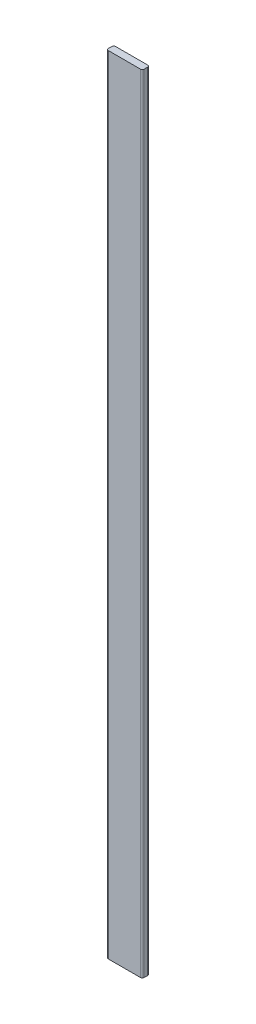
ISO-10303-21;
HEADER;
FILE_DESCRIPTION(('STEP AP214'),'2;1');
FILE_NAME('part.step','',(''),(''),'','','');
FILE_SCHEMA(('AUTOMOTIVE_DESIGN { 1 0 10303 214 1 1 1 1 }'));
ENDSEC;
DATA;
#1=APPLICATION_CONTEXT('core data for automotive mechanical design processes');
#2=APPLICATION_PROTOCOL_DEFINITION('international standard','automotive_design',2000,#1);
#3=PRODUCT_CONTEXT('',#1,'mechanical');
#4=PRODUCT('Part','Part','',(#3));
#5=PRODUCT_RELATED_PRODUCT_CATEGORY('part','',(#4));
#6=PRODUCT_DEFINITION_FORMATION('','',#4);
#7=PRODUCT_DEFINITION_CONTEXT('part definition',#1,'design');
#8=PRODUCT_DEFINITION('design','',#6,#7);
#9=PRODUCT_DEFINITION_SHAPE('','',#8);
#10=(LENGTH_UNIT() NAMED_UNIT(*) SI_UNIT(.MILLI.,.METRE.));
#11=(NAMED_UNIT(*) PLANE_ANGLE_UNIT() SI_UNIT($,.RADIAN.));
#12=(NAMED_UNIT(*) SI_UNIT($,.STERADIAN.) SOLID_ANGLE_UNIT());
#13=UNCERTAINTY_MEASURE_WITH_UNIT(LENGTH_MEASURE(1.E-05),#10,'distance_accuracy_value','');
#14=(GEOMETRIC_REPRESENTATION_CONTEXT(3) GLOBAL_UNCERTAINTY_ASSIGNED_CONTEXT((#13)) GLOBAL_UNIT_ASSIGNED_CONTEXT((#10,
#11,#12)) REPRESENTATION_CONTEXT('',''));
#15=CARTESIAN_POINT('',(0.,0.,0.));
#16=DIRECTION('',(0.,0.,1.));
#17=DIRECTION('',(1.,0.,0.));
#18=AXIS2_PLACEMENT_3D('',#15,#16,#17);
#19=CARTESIAN_POINT('',(-381.578947368421,2127.63157894737,20.));
#20=DIRECTION('',(1.,0.,0.));
#21=DIRECTION('',(0.,1.,0.));
#22=AXIS2_PLACEMENT_3D('',#19,#20,#21);
#23=PLANE('',#22);
#24=DIRECTION('',(0.,0.,-1.));
#25=VECTOR('',#24,1.);
#26=CARTESIAN_POINT('',(-381.578947368421,2127.63157894737,20.));
#27=LINE('',#26,#25);
#28=CARTESIAN_POINT('',(-381.578947368421,2127.63157894737,15.));
#29=VERTEX_POINT('',#28);
#30=CARTESIAN_POINT('',(-381.578947368421,2127.63157894737,5.));
#31=VERTEX_POINT('',#30);
#32=EDGE_CURVE('E161',#29,#31,#27,.T.);
#33=ORIENTED_EDGE('',*,*,#32,.T.);
#34=DIRECTION('',(0.,-1.,0.));
#35=VECTOR('',#34,1.);
#36=CARTESIAN_POINT('',(-381.578947368421,2127.63157894737,5.));
#37=LINE('',#36,#35);
#38=CARTESIAN_POINT('',(-381.57894736842,-72.3684210526315,5.));
#39=VERTEX_POINT('',#38);
#40=EDGE_CURVE('E117',#31,#39,#37,.T.);
#41=ORIENTED_EDGE('',*,*,#40,.T.);
#42=DIRECTION('',(0.,0.,-1.));
#43=VECTOR('',#42,1.);
#44=CARTESIAN_POINT('',(-381.57894736842,-72.3684210526315,20.));
#45=LINE('',#44,#43);
#46=CARTESIAN_POINT('',(-381.57894736842,-72.3684210526315,15.));
#47=VERTEX_POINT('',#46);
#48=EDGE_CURVE('E101',#47,#39,#45,.T.);
#49=ORIENTED_EDGE('',*,*,#48,.F.);
#50=DIRECTION('',(0.,-1.,0.));
#51=VECTOR('',#50,1.);
#52=CARTESIAN_POINT('',(-381.578947368421,2127.63157894737,15.));
#53=LINE('',#52,#51);
#54=EDGE_CURVE('E114',#47,#29,#53,.F.);
#55=ORIENTED_EDGE('',*,*,#54,.T.);
#56=EDGE_LOOP('',(#33,#41,#49,#55));
#57=FACE_BOUND('',#56,.T.);
#58=ADVANCED_FACE('F32',(#57),#23,.F.);
#59=CARTESIAN_POINT('',(-381.57894736842,-72.3684210526315,20.));
#60=DIRECTION('',(0.,1.,0.));
#61=DIRECTION('',(0.,0.,1.));
#62=AXIS2_PLACEMENT_3D('',#59,#60,#61);
#63=PLANE('',#62);
#64=ORIENTED_EDGE('',*,*,#48,.T.);
#65=CARTESIAN_POINT('',(-376.57894736842,-72.3684210526314,5.));
#66=DIRECTION('',(0.,1.,0.));
#67=DIRECTION('',(0.,0.,1.));
#68=AXIS2_PLACEMENT_3D('',#65,#66,#67);
#69=CIRCLE('',#68,5.);
#70=CARTESIAN_POINT('',(-376.57894736842,-72.3684210526315,0.));
#71=VERTEX_POINT('',#70);
#72=EDGE_CURVE('E108',#39,#71,#69,.F.);
#73=ORIENTED_EDGE('',*,*,#72,.T.);
#74=DIRECTION('',(1.,0.,0.));
#75=VECTOR('',#74,1.);
#76=CARTESIAN_POINT('',(-381.57894736842,-72.3684210526315,0.));
#77=LINE('',#76,#75);
#78=CARTESIAN_POINT('',(-286.57894736842,-72.3684210526315,0.));
#79=VERTEX_POINT('',#78);
#80=EDGE_CURVE('E167',#71,#79,#77,.T.);
#81=ORIENTED_EDGE('',*,*,#80,.T.);
#82=CARTESIAN_POINT('',(-286.57894736842,-72.3684210526314,5.));
#83=DIRECTION('',(0.,1.,0.));
#84=DIRECTION('',(0.,0.,1.));
#85=AXIS2_PLACEMENT_3D('',#82,#83,#84);
#86=CIRCLE('',#85,5.);
#87=CARTESIAN_POINT('',(-281.57894736842,-72.3684210526315,5.));
#88=VERTEX_POINT('',#87);
#89=EDGE_CURVE('E109',#79,#88,#86,.F.);
#90=ORIENTED_EDGE('',*,*,#89,.T.);
#91=DIRECTION('',(0.,0.,-1.));
#92=VECTOR('',#91,1.);
#93=CARTESIAN_POINT('',(-281.57894736842,-72.3684210526315,20.));
#94=LINE('',#93,#92);
#95=CARTESIAN_POINT('',(-281.57894736842,-72.3684210526315,15.));
#96=VERTEX_POINT('',#95);
#97=EDGE_CURVE('E118',#96,#88,#94,.T.);
#98=ORIENTED_EDGE('',*,*,#97,.F.);
#99=CARTESIAN_POINT('',(-286.57894736842,-72.3684210526315,15.));
#100=DIRECTION('',(0.,1.,0.));
#101=DIRECTION('',(0.,0.,1.));
#102=AXIS2_PLACEMENT_3D('',#99,#100,#101);
#103=CIRCLE('',#102,5.);
#104=CARTESIAN_POINT('',(-286.57894736842,-72.3684210526315,20.));
#105=VERTEX_POINT('',#104);
#106=EDGE_CURVE('E124',#96,#105,#103,.F.);
#107=ORIENTED_EDGE('',*,*,#106,.T.);
#108=DIRECTION('',(1.,0.,0.));
#109=VECTOR('',#108,1.);
#110=CARTESIAN_POINT('',(-381.57894736842,-72.3684210526315,20.));
#111=LINE('',#110,#109);
#112=CARTESIAN_POINT('',(-376.57894736842,-72.3684210526315,20.));
#113=VERTEX_POINT('',#112);
#114=EDGE_CURVE('E103',#113,#105,#111,.T.);
#115=ORIENTED_EDGE('',*,*,#114,.F.);
#116=CARTESIAN_POINT('',(-376.57894736842,-72.3684210526315,15.));
#117=DIRECTION('',(0.,1.,0.));
#118=DIRECTION('',(0.,0.,1.));
#119=AXIS2_PLACEMENT_3D('',#116,#117,#118);
#120=CIRCLE('',#119,5.);
#121=EDGE_CURVE('E98',#113,#47,#120,.F.);
#122=ORIENTED_EDGE('',*,*,#121,.T.);
#123=EDGE_LOOP('',(#64,#73,#81,#90,#98,#107,#115,#122));
#124=FACE_BOUND('',#123,.T.);
#125=ADVANCED_FACE('F100',(#124),#63,.F.);
#126=CARTESIAN_POINT('',(-281.578947368421,2127.63157894737,20.));
#127=DIRECTION('',(-1.,0.,0.));
#128=DIRECTION('',(0.,-1.,0.));
#129=AXIS2_PLACEMENT_3D('',#126,#127,#128);
#130=PLANE('',#129);
#131=ORIENTED_EDGE('',*,*,#97,.T.);
#132=DIRECTION('',(0.,1.,0.));
#133=VECTOR('',#132,1.);
#134=CARTESIAN_POINT('',(-281.578947368421,2127.63157894737,5.));
#135=LINE('',#134,#133);
#136=CARTESIAN_POINT('',(-281.578947368421,2127.63157894737,5.));
#137=VERTEX_POINT('',#136);
#138=EDGE_CURVE('E11',#88,#137,#135,.T.);
#139=ORIENTED_EDGE('',*,*,#138,.T.);
#140=DIRECTION('',(0.,0.,-1.));
#141=VECTOR('',#140,1.);
#142=CARTESIAN_POINT('',(-281.578947368421,2127.63157894737,20.));
#143=LINE('',#142,#141);
#144=CARTESIAN_POINT('',(-281.578947368421,2127.63157894737,15.));
#145=VERTEX_POINT('',#144);
#146=EDGE_CURVE('E149',#145,#137,#143,.T.);
#147=ORIENTED_EDGE('',*,*,#146,.F.);
#148=DIRECTION('',(0.,1.,0.));
#149=VECTOR('',#148,1.);
#150=CARTESIAN_POINT('',(-281.57894736842,-72.3684210526315,15.));
#151=LINE('',#150,#149);
#152=EDGE_CURVE('E40',#145,#96,#151,.F.);
#153=ORIENTED_EDGE('',*,*,#152,.T.);
#154=EDGE_LOOP('',(#131,#139,#147,#153));
#155=FACE_BOUND('',#154,.T.);
#156=ADVANCED_FACE('F148',(#155),#130,.F.);
#157=CARTESIAN_POINT('',(-381.578947368421,2127.63157894737,20.));
#158=DIRECTION('',(0.,-1.,0.));
#159=DIRECTION('',(0.,0.,-1.));
#160=AXIS2_PLACEMENT_3D('',#157,#158,#159);
#161=PLANE('',#160);
#162=DIRECTION('',(-1.,0.,0.));
#163=VECTOR('',#162,1.);
#164=CARTESIAN_POINT('',(-381.578947368421,2127.63157894737,0.));
#165=LINE('',#164,#163);
#166=CARTESIAN_POINT('',(-286.578947368421,2127.63157894737,0.));
#167=VERTEX_POINT('',#166);
#168=CARTESIAN_POINT('',(-376.578947368421,2127.63157894737,0.));
#169=VERTEX_POINT('',#168);
#170=EDGE_CURVE('E164',#167,#169,#165,.T.);
#171=ORIENTED_EDGE('',*,*,#170,.T.);
#172=CARTESIAN_POINT('',(-376.578947368421,2127.63157894737,5.));
#173=DIRECTION('',(0.,-1.,0.));
#174=DIRECTION('',(0.,0.,-1.));
#175=AXIS2_PLACEMENT_3D('',#172,#173,#174);
#176=CIRCLE('',#175,5.);
#177=EDGE_CURVE('E138',#169,#31,#176,.F.);
#178=ORIENTED_EDGE('',*,*,#177,.T.);
#179=ORIENTED_EDGE('',*,*,#32,.F.);
#180=CARTESIAN_POINT('',(-376.578947368421,2127.63157894737,15.));
#181=DIRECTION('',(0.,-1.,0.));
#182=DIRECTION('',(0.,0.,-1.));
#183=AXIS2_PLACEMENT_3D('',#180,#181,#182);
#184=CIRCLE('',#183,5.);
#185=CARTESIAN_POINT('',(-376.578947368421,2127.63157894737,20.));
#186=VERTEX_POINT('',#185);
#187=EDGE_CURVE('E122',#29,#186,#184,.F.);
#188=ORIENTED_EDGE('',*,*,#187,.T.);
#189=DIRECTION('',(-1.,0.,0.));
#190=VECTOR('',#189,1.);
#191=CARTESIAN_POINT('',(-381.578947368421,2127.63157894737,20.));
#192=LINE('',#191,#190);
#193=CARTESIAN_POINT('',(-286.578947368421,2127.63157894737,20.));
#194=VERTEX_POINT('',#193);
#195=EDGE_CURVE('E158',#194,#186,#192,.T.);
#196=ORIENTED_EDGE('',*,*,#195,.F.);
#197=CARTESIAN_POINT('',(-286.578947368421,2127.63157894737,15.));
#198=DIRECTION('',(0.,-1.,0.));
#199=DIRECTION('',(0.,0.,-1.));
#200=AXIS2_PLACEMENT_3D('',#197,#198,#199);
#201=CIRCLE('',#200,5.);
#202=EDGE_CURVE('E54',#194,#145,#201,.F.);
#203=ORIENTED_EDGE('',*,*,#202,.T.);
#204=ORIENTED_EDGE('',*,*,#146,.T.);
#205=CARTESIAN_POINT('',(-286.578947368421,2127.63157894737,5.));
#206=DIRECTION('',(0.,-1.,0.));
#207=DIRECTION('',(0.,0.,-1.));
#208=AXIS2_PLACEMENT_3D('',#205,#206,#207);
#209=CIRCLE('',#208,5.);
#210=EDGE_CURVE('E47',#137,#167,#209,.F.);
#211=ORIENTED_EDGE('',*,*,#210,.T.);
#212=EDGE_LOOP('',(#171,#178,#179,#188,#196,#203,#204,#211));
#213=FACE_BOUND('',#212,.T.);
#214=ADVANCED_FACE('F160',(#213),#161,.F.);
#215=CARTESIAN_POINT('',(0.,0.,20.));
#216=DIRECTION('',(0.,0.,1.));
#217=DIRECTION('',(1.,0.,0.));
#218=AXIS2_PLACEMENT_3D('',#215,#216,#217);
#219=PLANE('',#218);
#220=ORIENTED_EDGE('',*,*,#195,.T.);
#221=DIRECTION('',(0.,-1.,0.));
#222=VECTOR('',#221,1.);
#223=CARTESIAN_POINT('',(-376.57894736842,-72.3684210526315,20.));
#224=LINE('',#223,#222);
#225=EDGE_CURVE('E143',#186,#113,#224,.T.);
#226=ORIENTED_EDGE('',*,*,#225,.T.);
#227=ORIENTED_EDGE('',*,*,#114,.T.);
#228=DIRECTION('',(0.,1.,0.));
#229=VECTOR('',#228,1.);
#230=CARTESIAN_POINT('',(-286.578947368421,2127.63157894737,20.));
#231=LINE('',#230,#229);
#232=EDGE_CURVE('E140',#105,#194,#231,.T.);
#233=ORIENTED_EDGE('',*,*,#232,.T.);
#234=EDGE_LOOP('',(#220,#226,#227,#233));
#235=FACE_BOUND('',#234,.T.);
#236=ADVANCED_FACE('F157',(#235),#219,.T.);
#237=CARTESIAN_POINT('',(0.,0.,0.));
#238=DIRECTION('',(0.,0.,1.));
#239=DIRECTION('',(1.,0.,0.));
#240=AXIS2_PLACEMENT_3D('',#237,#238,#239);
#241=PLANE('',#240);
#242=ORIENTED_EDGE('',*,*,#80,.F.);
#243=DIRECTION('',(0.,-1.,0.));
#244=VECTOR('',#243,1.);
#245=CARTESIAN_POINT('',(-376.57894736842,0.,0.));
#246=LINE('',#245,#244);
#247=EDGE_CURVE('E133',#71,#169,#246,.F.);
#248=ORIENTED_EDGE('',*,*,#247,.T.);
#249=ORIENTED_EDGE('',*,*,#170,.F.);
#250=DIRECTION('',(0.,1.,0.));
#251=VECTOR('',#250,1.);
#252=CARTESIAN_POINT('',(-286.57894736842,0.,0.));
#253=LINE('',#252,#251);
#254=EDGE_CURVE('E131',#167,#79,#253,.F.);
#255=ORIENTED_EDGE('',*,*,#254,.T.);
#256=EDGE_LOOP('',(#242,#248,#249,#255));
#257=FACE_BOUND('',#256,.T.);
#258=ADVANCED_FACE('F174',(#257),#241,.F.);
#259=CARTESIAN_POINT('',(-376.578947368421,2127.63157894737,5.));
#260=DIRECTION('',(0.,-1.,0.));
#261=DIRECTION('',(1.,0.,0.));
#262=AXIS2_PLACEMENT_3D('',#259,#260,#261);
#263=CYLINDRICAL_SURFACE('',#262,5.);
#264=ORIENTED_EDGE('',*,*,#177,.F.);
#265=ORIENTED_EDGE('',*,*,#247,.F.);
#266=ORIENTED_EDGE('',*,*,#72,.F.);
#267=ORIENTED_EDGE('',*,*,#40,.F.);
#268=EDGE_LOOP('',(#264,#265,#266,#267));
#269=FACE_BOUND('',#268,.T.);
#270=ADVANCED_FACE('F182',(#269),#263,.T.);
#271=CARTESIAN_POINT('',(-376.57894736842,0.,15.));
#272=DIRECTION('',(0.,1.,0.));
#273=DIRECTION('',(-1.,0.,0.));
#274=AXIS2_PLACEMENT_3D('',#271,#272,#273);
#275=CYLINDRICAL_SURFACE('',#274,5.);
#276=ORIENTED_EDGE('',*,*,#187,.F.);
#277=ORIENTED_EDGE('',*,*,#54,.F.);
#278=ORIENTED_EDGE('',*,*,#121,.F.);
#279=ORIENTED_EDGE('',*,*,#225,.F.);
#280=EDGE_LOOP('',(#276,#277,#278,#279));
#281=FACE_BOUND('',#280,.T.);
#282=ADVANCED_FACE('F121',(#281),#275,.T.);
#283=CARTESIAN_POINT('',(-286.578947368421,2127.63157894737,5.));
#284=DIRECTION('',(0.,1.,0.));
#285=DIRECTION('',(-1.,0.,0.));
#286=AXIS2_PLACEMENT_3D('',#283,#284,#285);
#287=CYLINDRICAL_SURFACE('',#286,5.);
#288=ORIENTED_EDGE('',*,*,#89,.F.);
#289=ORIENTED_EDGE('',*,*,#254,.F.);
#290=ORIENTED_EDGE('',*,*,#210,.F.);
#291=ORIENTED_EDGE('',*,*,#138,.F.);
#292=EDGE_LOOP('',(#288,#289,#290,#291));
#293=FACE_BOUND('',#292,.T.);
#294=ADVANCED_FACE('F176',(#293),#287,.T.);
#295=CARTESIAN_POINT('',(-286.57894736842,0.,15.));
#296=DIRECTION('',(0.,-1.,0.));
#297=DIRECTION('',(1.,0.,0.));
#298=AXIS2_PLACEMENT_3D('',#295,#296,#297);
#299=CYLINDRICAL_SURFACE('',#298,5.);
#300=ORIENTED_EDGE('',*,*,#106,.F.);
#301=ORIENTED_EDGE('',*,*,#152,.F.);
#302=ORIENTED_EDGE('',*,*,#202,.F.);
#303=ORIENTED_EDGE('',*,*,#232,.F.);
#304=EDGE_LOOP('',(#300,#301,#302,#303));
#305=FACE_BOUND('',#304,.T.);
#306=ADVANCED_FACE('F34',(#305),#299,.T.);
#307=CLOSED_SHELL('',(#58,#125,#156,#214,#236,#258,#270,#282,#294,#306));
#308=MANIFOLD_SOLID_BREP('B2',#307);
#309=ADVANCED_BREP_SHAPE_REPRESENTATION('',(#18,#308),#14);
#310=SHAPE_DEFINITION_REPRESENTATION(#9,#309);
ENDSEC;
END-ISO-10303-21;
